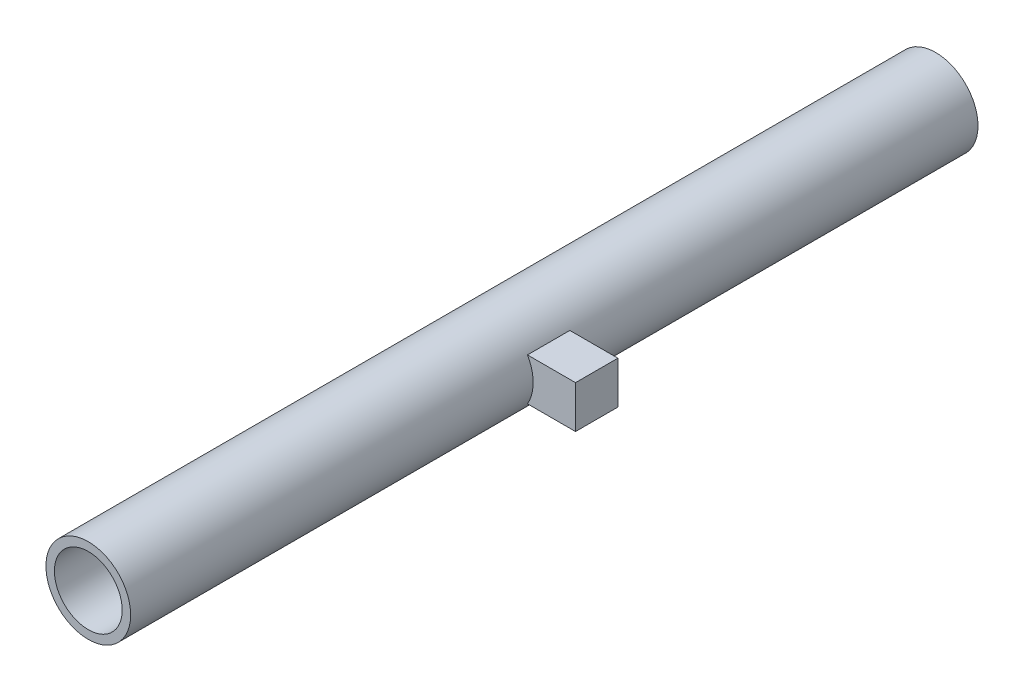
ISO-10303-21;
HEADER;
FILE_DESCRIPTION(('STEP AP214'),'2;1');
FILE_NAME('part.step','',(''),(''),'','','');
FILE_SCHEMA(('AUTOMOTIVE_DESIGN { 1 0 10303 214 1 1 1 1 }'));
ENDSEC;
DATA;
#1=APPLICATION_CONTEXT('core data for automotive mechanical design processes');
#2=APPLICATION_PROTOCOL_DEFINITION('international standard','automotive_design',2000,#1);
#3=PRODUCT_CONTEXT('',#1,'mechanical');
#4=PRODUCT('Part','Part','',(#3));
#5=PRODUCT_RELATED_PRODUCT_CATEGORY('part','',(#4));
#6=PRODUCT_DEFINITION_FORMATION('','',#4);
#7=PRODUCT_DEFINITION_CONTEXT('part definition',#1,'design');
#8=PRODUCT_DEFINITION('design','',#6,#7);
#9=PRODUCT_DEFINITION_SHAPE('','',#8);
#10=(LENGTH_UNIT() NAMED_UNIT(*) SI_UNIT(.MILLI.,.METRE.));
#11=(NAMED_UNIT(*) PLANE_ANGLE_UNIT() SI_UNIT($,.RADIAN.));
#12=(NAMED_UNIT(*) SI_UNIT($,.STERADIAN.) SOLID_ANGLE_UNIT());
#13=UNCERTAINTY_MEASURE_WITH_UNIT(LENGTH_MEASURE(1.E-05),#10,'distance_accuracy_value','');
#14=(GEOMETRIC_REPRESENTATION_CONTEXT(3) GLOBAL_UNCERTAINTY_ASSIGNED_CONTEXT((#13)) GLOBAL_UNIT_ASSIGNED_CONTEXT((#10,
#11,#12)) REPRESENTATION_CONTEXT('',''));
#15=CARTESIAN_POINT('',(0.,0.,0.));
#16=DIRECTION('',(0.,0.,1.));
#17=DIRECTION('',(1.,0.,0.));
#18=AXIS2_PLACEMENT_3D('',#15,#16,#17);
#19=CARTESIAN_POINT('',(0.,0.,100.));
#20=DIRECTION('',(0.,0.,1.));
#21=DIRECTION('',(1.,0.,0.));
#22=AXIS2_PLACEMENT_3D('',#19,#20,#21);
#23=PLANE('',#22);
#24=CARTESIAN_POINT('',(0.,0.,100.));
#25=DIRECTION('',(0.,0.,1.));
#26=DIRECTION('',(1.,0.,0.));
#27=AXIS2_PLACEMENT_3D('',#24,#25,#26);
#28=CIRCLE('',#27,5.);
#29=CARTESIAN_POINT('',(5.,0.,100.));
#30=VERTEX_POINT('',#29);
#31=EDGE_CURVE('E11',#30,#30,#28,.T.);
#32=ORIENTED_EDGE('',*,*,#31,.T.);
#33=EDGE_LOOP('',(#32));
#34=FACE_BOUND('',#33,.T.);
#35=CARTESIAN_POINT('',(0.,0.,100.));
#36=DIRECTION('',(0.,0.,1.));
#37=DIRECTION('',(1.,0.,0.));
#38=AXIS2_PLACEMENT_3D('',#35,#36,#37);
#39=CIRCLE('',#38,4.);
#40=CARTESIAN_POINT('',(4.,0.,100.));
#41=VERTEX_POINT('',#40);
#42=EDGE_CURVE('E111',#41,#41,#39,.T.);
#43=ORIENTED_EDGE('',*,*,#42,.F.);
#44=EDGE_LOOP('',(#43));
#45=FACE_BOUND('',#44,.T.);
#46=ADVANCED_FACE('F45',(#34,#45),#23,.T.);
#47=CARTESIAN_POINT('',(0.,0.,0.));
#48=DIRECTION('',(0.,0.,1.));
#49=DIRECTION('',(1.,0.,0.));
#50=AXIS2_PLACEMENT_3D('',#47,#48,#49);
#51=PLANE('',#50);
#52=CARTESIAN_POINT('',(0.,0.,0.));
#53=DIRECTION('',(0.,0.,1.));
#54=DIRECTION('',(1.,0.,0.));
#55=AXIS2_PLACEMENT_3D('',#52,#53,#54);
#56=CIRCLE('',#55,5.);
#57=CARTESIAN_POINT('',(5.,0.,0.));
#58=VERTEX_POINT('',#57);
#59=EDGE_CURVE('E49',#58,#58,#56,.T.);
#60=ORIENTED_EDGE('',*,*,#59,.F.);
#61=EDGE_LOOP('',(#60));
#62=FACE_BOUND('',#61,.T.);
#63=CARTESIAN_POINT('',(0.,0.,0.));
#64=DIRECTION('',(0.,0.,1.));
#65=DIRECTION('',(1.,0.,0.));
#66=AXIS2_PLACEMENT_3D('',#63,#64,#65);
#67=CIRCLE('',#66,4.);
#68=CARTESIAN_POINT('',(4.,0.,0.));
#69=VERTEX_POINT('',#68);
#70=EDGE_CURVE('E107',#69,#69,#67,.T.);
#71=ORIENTED_EDGE('',*,*,#70,.T.);
#72=EDGE_LOOP('',(#71));
#73=FACE_BOUND('',#72,.T.);
#74=ADVANCED_FACE('F129',(#62,#73),#51,.F.);
#75=CARTESIAN_POINT('',(0.,0.,100.));
#76=DIRECTION('',(0.,0.,-1.));
#77=DIRECTION('',(-1.,0.,0.));
#78=AXIS2_PLACEMENT_3D('',#75,#76,#77);
#79=CYLINDRICAL_SURFACE('',#78,5.);
#80=CARTESIAN_POINT('',(0.,0.,52.5));
#81=DIRECTION('',(0.,0.,-1.));
#82=DIRECTION('',(-1.,0.,0.));
#83=AXIS2_PLACEMENT_3D('',#80,#81,#82);
#84=CIRCLE('',#83,5.);
#85=CARTESIAN_POINT('',(4.33012701892219,-2.5,52.5));
#86=VERTEX_POINT('',#85);
#87=CARTESIAN_POINT('',(4.33012701892219,2.5,52.5));
#88=VERTEX_POINT('',#87);
#89=EDGE_CURVE('E86',#86,#88,#84,.F.);
#90=ORIENTED_EDGE('',*,*,#89,.T.);
#91=DIRECTION('',(0.,0.,-1.));
#92=VECTOR('',#91,1.);
#93=CARTESIAN_POINT('',(4.33012701892219,2.5,100.));
#94=LINE('',#93,#92);
#95=CARTESIAN_POINT('',(4.33012701892219,2.5,47.5));
#96=VERTEX_POINT('',#95);
#97=EDGE_CURVE('E61',#96,#88,#94,.F.);
#98=ORIENTED_EDGE('',*,*,#97,.F.);
#99=CARTESIAN_POINT('',(0.,0.,47.5));
#100=DIRECTION('',(0.,0.,-1.));
#101=DIRECTION('',(-1.,0.,0.));
#102=AXIS2_PLACEMENT_3D('',#99,#100,#101);
#103=CIRCLE('',#102,5.);
#104=CARTESIAN_POINT('',(4.33012701892219,-2.50000000000001,47.5));
#105=VERTEX_POINT('',#104);
#106=EDGE_CURVE('E65',#105,#96,#103,.F.);
#107=ORIENTED_EDGE('',*,*,#106,.F.);
#108=DIRECTION('',(0.,0.,-1.));
#109=VECTOR('',#108,1.);
#110=CARTESIAN_POINT('',(4.33012701892219,-2.50000000000001,100.));
#111=LINE('',#110,#109);
#112=EDGE_CURVE('E82',#105,#86,#111,.F.);
#113=ORIENTED_EDGE('',*,*,#112,.T.);
#114=EDGE_LOOP('',(#90,#98,#107,#113));
#115=FACE_BOUND('',#114,.T.);
#116=ORIENTED_EDGE('',*,*,#31,.F.);
#117=EDGE_LOOP('',(#116));
#118=FACE_BOUND('',#117,.T.);
#119=ORIENTED_EDGE('',*,*,#59,.T.);
#120=EDGE_LOOP('',(#119));
#121=FACE_BOUND('',#120,.T.);
#122=ADVANCED_FACE('F47',(#115,#118,#121),#79,.T.);
#123=CARTESIAN_POINT('',(0.,0.,100.));
#124=DIRECTION('',(0.,0.,-1.));
#125=DIRECTION('',(-1.,0.,0.));
#126=AXIS2_PLACEMENT_3D('',#123,#124,#125);
#127=CYLINDRICAL_SURFACE('',#126,4.);
#128=ORIENTED_EDGE('',*,*,#42,.T.);
#129=EDGE_LOOP('',(#128));
#130=FACE_BOUND('',#129,.T.);
#131=ORIENTED_EDGE('',*,*,#70,.F.);
#132=EDGE_LOOP('',(#131));
#133=FACE_BOUND('',#132,.T.);
#134=ADVANCED_FACE('F134',(#130,#133),#127,.F.);
#135=CARTESIAN_POINT('',(-5.001,2.5,47.5));
#136=DIRECTION('',(0.,1.,0.));
#137=DIRECTION('',(0.,0.,1.));
#138=AXIS2_PLACEMENT_3D('',#135,#136,#137);
#139=PLANE('',#138);
#140=DIRECTION('',(1.,0.,0.));
#141=VECTOR('',#140,1.);
#142=CARTESIAN_POINT('',(-5.001,2.5,47.5));
#143=LINE('',#142,#141);
#144=CARTESIAN_POINT('',(10.,2.5,47.5));
#145=VERTEX_POINT('',#144);
#146=EDGE_CURVE('E117',#96,#145,#143,.T.);
#147=ORIENTED_EDGE('',*,*,#146,.F.);
#148=ORIENTED_EDGE('',*,*,#97,.T.);
#149=DIRECTION('',(1.,0.,0.));
#150=VECTOR('',#149,1.);
#151=CARTESIAN_POINT('',(-5.001,2.5,52.5));
#152=LINE('',#151,#150);
#153=CARTESIAN_POINT('',(10.,2.5,52.5));
#154=VERTEX_POINT('',#153);
#155=EDGE_CURVE('E105',#88,#154,#152,.T.);
#156=ORIENTED_EDGE('',*,*,#155,.T.);
#157=DIRECTION('',(0.,0.,1.));
#158=VECTOR('',#157,1.);
#159=CARTESIAN_POINT('',(10.,2.5,47.5));
#160=LINE('',#159,#158);
#161=EDGE_CURVE('E215',#145,#154,#160,.T.);
#162=ORIENTED_EDGE('',*,*,#161,.F.);
#163=EDGE_LOOP('',(#147,#148,#156,#162));
#164=FACE_BOUND('',#163,.T.);
#165=ADVANCED_FACE('F136',(#164),#139,.T.);
#166=CARTESIAN_POINT('',(-5.001,-2.5,47.5));
#167=DIRECTION('',(0.,0.,-1.));
#168=DIRECTION('',(-1.,0.,0.));
#169=AXIS2_PLACEMENT_3D('',#166,#167,#168);
#170=PLANE('',#169);
#171=DIRECTION('',(1.,0.,0.));
#172=VECTOR('',#171,1.);
#173=CARTESIAN_POINT('',(-5.001,-2.5,47.5));
#174=LINE('',#173,#172);
#175=CARTESIAN_POINT('',(10.,-2.5,47.5));
#176=VERTEX_POINT('',#175);
#177=EDGE_CURVE('E228',#105,#176,#174,.T.);
#178=ORIENTED_EDGE('',*,*,#177,.F.);
#179=ORIENTED_EDGE('',*,*,#106,.T.);
#180=ORIENTED_EDGE('',*,*,#146,.T.);
#181=DIRECTION('',(0.,1.,0.));
#182=VECTOR('',#181,1.);
#183=CARTESIAN_POINT('',(10.,-2.5,47.5));
#184=LINE('',#183,#182);
#185=EDGE_CURVE('E90',#176,#145,#184,.T.);
#186=ORIENTED_EDGE('',*,*,#185,.F.);
#187=EDGE_LOOP('',(#178,#179,#180,#186));
#188=FACE_BOUND('',#187,.T.);
#189=ADVANCED_FACE('F142',(#188),#170,.T.);
#190=CARTESIAN_POINT('',(-5.001,-2.5,47.5));
#191=DIRECTION('',(0.,1.,0.));
#192=DIRECTION('',(0.,0.,1.));
#193=AXIS2_PLACEMENT_3D('',#190,#191,#192);
#194=PLANE('',#193);
#195=ORIENTED_EDGE('',*,*,#112,.F.);
#196=ORIENTED_EDGE('',*,*,#177,.T.);
#197=DIRECTION('',(0.,0.,1.));
#198=VECTOR('',#197,1.);
#199=CARTESIAN_POINT('',(10.,-2.5,47.5));
#200=LINE('',#199,#198);
#201=CARTESIAN_POINT('',(10.,-2.5,52.5));
#202=VERTEX_POINT('',#201);
#203=EDGE_CURVE('E96',#176,#202,#200,.T.);
#204=ORIENTED_EDGE('',*,*,#203,.T.);
#205=DIRECTION('',(1.,0.,0.));
#206=VECTOR('',#205,1.);
#207=CARTESIAN_POINT('',(-5.001,-2.5,52.5));
#208=LINE('',#207,#206);
#209=EDGE_CURVE('E93',#86,#202,#208,.T.);
#210=ORIENTED_EDGE('',*,*,#209,.F.);
#211=EDGE_LOOP('',(#195,#196,#204,#210));
#212=FACE_BOUND('',#211,.T.);
#213=ADVANCED_FACE('F94',(#212),#194,.F.);
#214=CARTESIAN_POINT('',(-5.001,-2.5,52.5));
#215=DIRECTION('',(0.,0.,-1.));
#216=DIRECTION('',(-1.,0.,0.));
#217=AXIS2_PLACEMENT_3D('',#214,#215,#216);
#218=PLANE('',#217);
#219=ORIENTED_EDGE('',*,*,#89,.F.);
#220=ORIENTED_EDGE('',*,*,#209,.T.);
#221=DIRECTION('',(0.,1.,0.));
#222=VECTOR('',#221,1.);
#223=CARTESIAN_POINT('',(10.,-2.5,52.5));
#224=LINE('',#223,#222);
#225=EDGE_CURVE('E101',#202,#154,#224,.T.);
#226=ORIENTED_EDGE('',*,*,#225,.T.);
#227=ORIENTED_EDGE('',*,*,#155,.F.);
#228=EDGE_LOOP('',(#219,#220,#226,#227));
#229=FACE_BOUND('',#228,.T.);
#230=ADVANCED_FACE('F104',(#229),#218,.F.);
#231=CARTESIAN_POINT('',(10.,0.,0.));
#232=DIRECTION('',(-1.,0.,0.));
#233=DIRECTION('',(0.,0.,1.));
#234=AXIS2_PLACEMENT_3D('',#231,#232,#233);
#235=PLANE('',#234);
#236=ORIENTED_EDGE('',*,*,#161,.T.);
#237=ORIENTED_EDGE('',*,*,#225,.F.);
#238=ORIENTED_EDGE('',*,*,#203,.F.);
#239=ORIENTED_EDGE('',*,*,#185,.T.);
#240=EDGE_LOOP('',(#236,#237,#238,#239));
#241=FACE_BOUND('',#240,.T.);
#242=ADVANCED_FACE('F201',(#241),#235,.F.);
#243=CLOSED_SHELL('',(#46,#74,#122,#134,#165,#189,#213,#230,#242));
#244=MANIFOLD_SOLID_BREP('B2',#243);
#245=ADVANCED_BREP_SHAPE_REPRESENTATION('',(#18,#244),#14);
#246=SHAPE_DEFINITION_REPRESENTATION(#9,#245);
ENDSEC;
END-ISO-10303-21;
